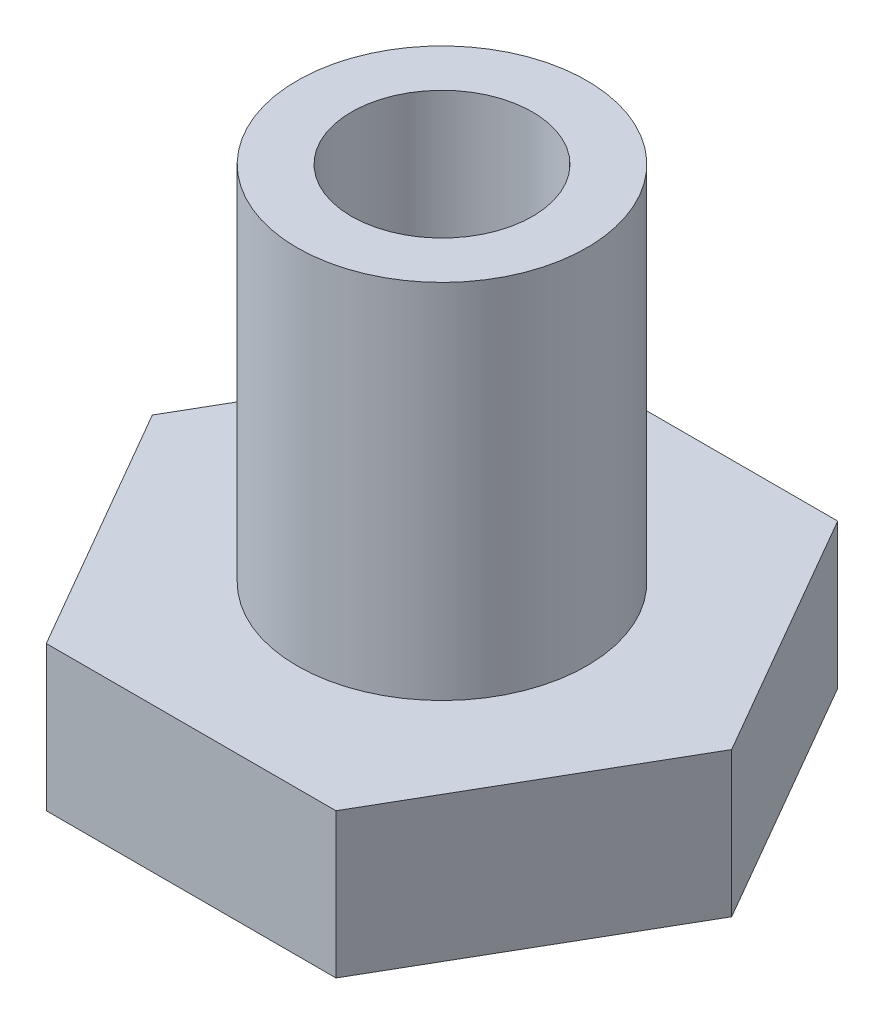
ISO-10303-21;
HEADER;
FILE_DESCRIPTION(('STEP AP214'),'2;1');
FILE_NAME('part.step','',(''),(''),'','','');
FILE_SCHEMA(('AUTOMOTIVE_DESIGN { 1 0 10303 214 1 1 1 1 }'));
ENDSEC;
DATA;
#1=APPLICATION_CONTEXT('core data for automotive mechanical design processes');
#2=APPLICATION_PROTOCOL_DEFINITION('international standard','automotive_design',2000,#1);
#3=PRODUCT_CONTEXT('',#1,'mechanical');
#4=PRODUCT('Part','Part','',(#3));
#5=PRODUCT_RELATED_PRODUCT_CATEGORY('part','',(#4));
#6=PRODUCT_DEFINITION_FORMATION('','',#4);
#7=PRODUCT_DEFINITION_CONTEXT('part definition',#1,'design');
#8=PRODUCT_DEFINITION('design','',#6,#7);
#9=PRODUCT_DEFINITION_SHAPE('','',#8);
#10=(LENGTH_UNIT() NAMED_UNIT(*) SI_UNIT(.MILLI.,.METRE.));
#11=(NAMED_UNIT(*) PLANE_ANGLE_UNIT() SI_UNIT($,.RADIAN.));
#12=(NAMED_UNIT(*) SI_UNIT($,.STERADIAN.) SOLID_ANGLE_UNIT());
#13=UNCERTAINTY_MEASURE_WITH_UNIT(LENGTH_MEASURE(1.E-05),#10,'distance_accuracy_value','');
#14=(GEOMETRIC_REPRESENTATION_CONTEXT(3) GLOBAL_UNCERTAINTY_ASSIGNED_CONTEXT((#13)) GLOBAL_UNIT_ASSIGNED_CONTEXT((#10,
#11,#12)) REPRESENTATION_CONTEXT('',''));
#15=CARTESIAN_POINT('',(0.,0.,0.));
#16=DIRECTION('',(0.,0.,1.));
#17=DIRECTION('',(1.,0.,0.));
#18=AXIS2_PLACEMENT_3D('',#15,#16,#17);
#19=CARTESIAN_POINT('',(-8.,8.,13.856406460551));
#20=DIRECTION('',(0.,0.,-1.));
#21=DIRECTION('',(-1.,0.,0.));
#22=AXIS2_PLACEMENT_3D('',#19,#20,#21);
#23=PLANE('',#22);
#24=DIRECTION('',(1.,0.,0.));
#25=VECTOR('',#24,1.);
#26=CARTESIAN_POINT('',(-8.,0.,13.856406460551));
#27=LINE('',#26,#25);
#28=CARTESIAN_POINT('',(-8.,0.,13.856406460551));
#29=VERTEX_POINT('',#28);
#30=CARTESIAN_POINT('',(8.,0.,13.856406460551));
#31=VERTEX_POINT('',#30);
#32=EDGE_CURVE('E119',#29,#31,#27,.T.);
#33=ORIENTED_EDGE('',*,*,#32,.T.);
#34=DIRECTION('',(0.,-1.,0.));
#35=VECTOR('',#34,1.);
#36=CARTESIAN_POINT('',(8.,8.,13.856406460551));
#37=LINE('',#36,#35);
#38=CARTESIAN_POINT('',(8.,8.,13.856406460551));
#39=VERTEX_POINT('',#38);
#40=EDGE_CURVE('E11',#39,#31,#37,.T.);
#41=ORIENTED_EDGE('',*,*,#40,.F.);
#42=DIRECTION('',(1.,0.,0.));
#43=VECTOR('',#42,1.);
#44=CARTESIAN_POINT('',(-8.,8.,13.856406460551));
#45=LINE('',#44,#43);
#46=CARTESIAN_POINT('',(-8.,8.,13.856406460551));
#47=VERTEX_POINT('',#46);
#48=EDGE_CURVE('E130',#47,#39,#45,.T.);
#49=ORIENTED_EDGE('',*,*,#48,.F.);
#50=DIRECTION('',(0.,-1.,0.));
#51=VECTOR('',#50,1.);
#52=CARTESIAN_POINT('',(-8.,8.,13.856406460551));
#53=LINE('',#52,#51);
#54=EDGE_CURVE('E115',#47,#29,#53,.T.);
#55=ORIENTED_EDGE('',*,*,#54,.T.);
#56=EDGE_LOOP('',(#33,#41,#49,#55));
#57=FACE_BOUND('',#56,.T.);
#58=ADVANCED_FACE('F35',(#57),#23,.F.);
#59=CARTESIAN_POINT('',(8.,8.,13.856406460551));
#60=DIRECTION('',(-0.866025403784439,0.,-0.5));
#61=DIRECTION('',(-0.5,0.,0.866025403784438));
#62=AXIS2_PLACEMENT_3D('',#59,#60,#61);
#63=PLANE('',#62);
#64=DIRECTION('',(0.5,0.,-0.866025403784438));
#65=VECTOR('',#64,1.);
#66=CARTESIAN_POINT('',(8.,0.,13.856406460551));
#67=LINE('',#66,#65);
#68=CARTESIAN_POINT('',(16.,0.,0.));
#69=VERTEX_POINT('',#68);
#70=EDGE_CURVE('E122',#31,#69,#67,.T.);
#71=ORIENTED_EDGE('',*,*,#70,.T.);
#72=DIRECTION('',(0.,-1.,0.));
#73=VECTOR('',#72,1.);
#74=CARTESIAN_POINT('',(16.,8.,0.));
#75=LINE('',#74,#73);
#76=CARTESIAN_POINT('',(16.,8.,0.));
#77=VERTEX_POINT('',#76);
#78=EDGE_CURVE('E43',#77,#69,#75,.T.);
#79=ORIENTED_EDGE('',*,*,#78,.F.);
#80=DIRECTION('',(0.5,0.,-0.866025403784438));
#81=VECTOR('',#80,1.);
#82=CARTESIAN_POINT('',(8.,8.,13.856406460551));
#83=LINE('',#82,#81);
#84=EDGE_CURVE('E88',#39,#77,#83,.T.);
#85=ORIENTED_EDGE('',*,*,#84,.F.);
#86=ORIENTED_EDGE('',*,*,#40,.T.);
#87=EDGE_LOOP('',(#71,#79,#85,#86));
#88=FACE_BOUND('',#87,.T.);
#89=ADVANCED_FACE('F155',(#88),#63,.F.);
#90=CARTESIAN_POINT('',(16.,8.,0.));
#91=DIRECTION('',(-0.866025403784439,0.,0.5));
#92=DIRECTION('',(0.5,0.,0.866025403784439));
#93=AXIS2_PLACEMENT_3D('',#90,#91,#92);
#94=PLANE('',#93);
#95=DIRECTION('',(-0.5,0.,-0.866025403784439));
#96=VECTOR('',#95,1.);
#97=CARTESIAN_POINT('',(16.,0.,0.));
#98=LINE('',#97,#96);
#99=CARTESIAN_POINT('',(8.00000000000001,0.,-13.856406460551));
#100=VERTEX_POINT('',#99);
#101=EDGE_CURVE('E125',#69,#100,#98,.T.);
#102=ORIENTED_EDGE('',*,*,#101,.T.);
#103=DIRECTION('',(0.,-1.,0.));
#104=VECTOR('',#103,1.);
#105=CARTESIAN_POINT('',(8.00000000000001,8.,-13.856406460551));
#106=LINE('',#105,#104);
#107=CARTESIAN_POINT('',(8.00000000000001,8.,-13.856406460551));
#108=VERTEX_POINT('',#107);
#109=EDGE_CURVE('E110',#108,#100,#106,.T.);
#110=ORIENTED_EDGE('',*,*,#109,.F.);
#111=DIRECTION('',(-0.5,0.,-0.866025403784439));
#112=VECTOR('',#111,1.);
#113=CARTESIAN_POINT('',(16.,8.,0.));
#114=LINE('',#113,#112);
#115=EDGE_CURVE('E101',#77,#108,#114,.T.);
#116=ORIENTED_EDGE('',*,*,#115,.F.);
#117=ORIENTED_EDGE('',*,*,#78,.T.);
#118=EDGE_LOOP('',(#102,#110,#116,#117));
#119=FACE_BOUND('',#118,.T.);
#120=ADVANCED_FACE('F136',(#119),#94,.F.);
#121=CARTESIAN_POINT('',(8.00000000000001,8.,-13.856406460551));
#122=DIRECTION('',(0.,0.,1.));
#123=DIRECTION('',(1.,0.,0.));
#124=AXIS2_PLACEMENT_3D('',#121,#122,#123);
#125=PLANE('',#124);
#126=DIRECTION('',(-1.,0.,0.));
#127=VECTOR('',#126,1.);
#128=CARTESIAN_POINT('',(8.00000000000001,0.,-13.856406460551));
#129=LINE('',#128,#127);
#130=CARTESIAN_POINT('',(-7.99999999999999,0.,-13.856406460551));
#131=VERTEX_POINT('',#130);
#132=EDGE_CURVE('E109',#100,#131,#129,.T.);
#133=ORIENTED_EDGE('',*,*,#132,.T.);
#134=DIRECTION('',(0.,-1.,0.));
#135=VECTOR('',#134,1.);
#136=CARTESIAN_POINT('',(-7.99999999999999,8.,-13.856406460551));
#137=LINE('',#136,#135);
#138=CARTESIAN_POINT('',(-7.99999999999999,8.,-13.856406460551));
#139=VERTEX_POINT('',#138);
#140=EDGE_CURVE('E106',#139,#131,#137,.T.);
#141=ORIENTED_EDGE('',*,*,#140,.F.);
#142=DIRECTION('',(-1.,0.,0.));
#143=VECTOR('',#142,1.);
#144=CARTESIAN_POINT('',(8.00000000000001,8.,-13.856406460551));
#145=LINE('',#144,#143);
#146=EDGE_CURVE('E95',#108,#139,#145,.T.);
#147=ORIENTED_EDGE('',*,*,#146,.F.);
#148=ORIENTED_EDGE('',*,*,#109,.T.);
#149=EDGE_LOOP('',(#133,#141,#147,#148));
#150=FACE_BOUND('',#149,.T.);
#151=ADVANCED_FACE('F107',(#150),#125,.F.);
#152=CARTESIAN_POINT('',(-7.99999999999999,8.,-13.856406460551));
#153=DIRECTION('',(0.866025403784439,0.,0.5));
#154=DIRECTION('',(0.5,0.,-0.866025403784439));
#155=AXIS2_PLACEMENT_3D('',#152,#153,#154);
#156=PLANE('',#155);
#157=DIRECTION('',(-0.5,0.,0.866025403784439));
#158=VECTOR('',#157,1.);
#159=CARTESIAN_POINT('',(-7.99999999999999,0.,-13.856406460551));
#160=LINE('',#159,#158);
#161=CARTESIAN_POINT('',(-16.,0.,0.));
#162=VERTEX_POINT('',#161);
#163=EDGE_CURVE('E74',#131,#162,#160,.T.);
#164=ORIENTED_EDGE('',*,*,#163,.T.);
#165=DIRECTION('',(0.,-1.,0.));
#166=VECTOR('',#165,1.);
#167=CARTESIAN_POINT('',(-16.,8.,0.));
#168=LINE('',#167,#166);
#169=CARTESIAN_POINT('',(-16.,8.,0.));
#170=VERTEX_POINT('',#169);
#171=EDGE_CURVE('E111',#170,#162,#168,.T.);
#172=ORIENTED_EDGE('',*,*,#171,.F.);
#173=DIRECTION('',(-0.5,0.,0.866025403784439));
#174=VECTOR('',#173,1.);
#175=CARTESIAN_POINT('',(-7.99999999999999,8.,-13.856406460551));
#176=LINE('',#175,#174);
#177=EDGE_CURVE('E99',#139,#170,#176,.T.);
#178=ORIENTED_EDGE('',*,*,#177,.F.);
#179=ORIENTED_EDGE('',*,*,#140,.T.);
#180=EDGE_LOOP('',(#164,#172,#178,#179));
#181=FACE_BOUND('',#180,.T.);
#182=ADVANCED_FACE('F113',(#181),#156,.F.);
#183=CARTESIAN_POINT('',(-16.,8.,0.));
#184=DIRECTION('',(0.866025403784439,0.,-0.5));
#185=DIRECTION('',(-0.5,0.,-0.866025403784439));
#186=AXIS2_PLACEMENT_3D('',#183,#184,#185);
#187=PLANE('',#186);
#188=DIRECTION('',(0.5,0.,0.866025403784439));
#189=VECTOR('',#188,1.);
#190=CARTESIAN_POINT('',(-16.,0.,0.));
#191=LINE('',#190,#189);
#192=EDGE_CURVE('E80',#162,#29,#191,.T.);
#193=ORIENTED_EDGE('',*,*,#192,.T.);
#194=ORIENTED_EDGE('',*,*,#54,.F.);
#195=DIRECTION('',(0.5,0.,0.866025403784439));
#196=VECTOR('',#195,1.);
#197=CARTESIAN_POINT('',(-16.,8.,0.));
#198=LINE('',#197,#196);
#199=EDGE_CURVE('E51',#170,#47,#198,.T.);
#200=ORIENTED_EDGE('',*,*,#199,.F.);
#201=ORIENTED_EDGE('',*,*,#171,.T.);
#202=EDGE_LOOP('',(#193,#194,#200,#201));
#203=FACE_BOUND('',#202,.T.);
#204=ADVANCED_FACE('F143',(#203),#187,.F.);
#205=CARTESIAN_POINT('',(0.,8.,0.));
#206=DIRECTION('',(0.,1.,0.));
#207=DIRECTION('',(0.,0.,1.));
#208=AXIS2_PLACEMENT_3D('',#205,#206,#207);
#209=PLANE('',#208);
#210=CARTESIAN_POINT('',(0.,8.,0.));
#211=DIRECTION('',(0.,1.,0.));
#212=DIRECTION('',(0.,0.,1.));
#213=AXIS2_PLACEMENT_3D('',#210,#211,#212);
#214=CIRCLE('',#213,8.);
#215=CARTESIAN_POINT('',(0.,8.,8.));
#216=VERTEX_POINT('',#215);
#217=EDGE_CURVE('E237',#216,#216,#214,.T.);
#218=ORIENTED_EDGE('',*,*,#217,.F.);
#219=EDGE_LOOP('',(#218));
#220=FACE_BOUND('',#219,.T.);
#221=ORIENTED_EDGE('',*,*,#48,.T.);
#222=ORIENTED_EDGE('',*,*,#84,.T.);
#223=ORIENTED_EDGE('',*,*,#115,.T.);
#224=ORIENTED_EDGE('',*,*,#146,.T.);
#225=ORIENTED_EDGE('',*,*,#177,.T.);
#226=ORIENTED_EDGE('',*,*,#199,.T.);
#227=EDGE_LOOP('',(#221,#222,#223,#224,#225,#226));
#228=FACE_BOUND('',#227,.T.);
#229=ADVANCED_FACE('F97',(#220,#228),#209,.T.);
#230=CARTESIAN_POINT('',(0.,0.,0.));
#231=DIRECTION('',(0.,1.,0.));
#232=DIRECTION('',(0.,0.,1.));
#233=AXIS2_PLACEMENT_3D('',#230,#231,#232);
#234=PLANE('',#233);
#235=ORIENTED_EDGE('',*,*,#32,.F.);
#236=ORIENTED_EDGE('',*,*,#192,.F.);
#237=ORIENTED_EDGE('',*,*,#163,.F.);
#238=ORIENTED_EDGE('',*,*,#132,.F.);
#239=ORIENTED_EDGE('',*,*,#101,.F.);
#240=ORIENTED_EDGE('',*,*,#70,.F.);
#241=EDGE_LOOP('',(#235,#236,#237,#238,#239,#240));
#242=FACE_BOUND('',#241,.T.);
#243=ADVANCED_FACE('F139',(#242),#234,.F.);
#244=CARTESIAN_POINT('',(0.,28.,0.));
#245=DIRECTION('',(0.,-1.,0.));
#246=DIRECTION('',(0.,0.,-1.));
#247=AXIS2_PLACEMENT_3D('',#244,#245,#246);
#248=CYLINDRICAL_SURFACE('',#247,8.);
#249=CARTESIAN_POINT('',(0.,28.,0.));
#250=DIRECTION('',(0.,1.,0.));
#251=DIRECTION('',(0.,0.,1.));
#252=AXIS2_PLACEMENT_3D('',#249,#250,#251);
#253=CIRCLE('',#252,8.);
#254=CARTESIAN_POINT('',(0.,28.,8.));
#255=VERTEX_POINT('',#254);
#256=EDGE_CURVE('E123',#255,#255,#253,.T.);
#257=ORIENTED_EDGE('',*,*,#256,.F.);
#258=EDGE_LOOP('',(#257));
#259=FACE_BOUND('',#258,.T.);
#260=ORIENTED_EDGE('',*,*,#217,.T.);
#261=EDGE_LOOP('',(#260));
#262=FACE_BOUND('',#261,.T.);
#263=ADVANCED_FACE('F187',(#259,#262),#248,.T.);
#264=CARTESIAN_POINT('',(0.,28.,0.));
#265=DIRECTION('',(0.,1.,0.));
#266=DIRECTION('',(0.,0.,1.));
#267=AXIS2_PLACEMENT_3D('',#264,#265,#266);
#268=PLANE('',#267);
#269=CARTESIAN_POINT('',(0.,28.,0.));
#270=DIRECTION('',(0.,1.,0.));
#271=DIRECTION('',(0.,0.,1.));
#272=AXIS2_PLACEMENT_3D('',#269,#270,#271);
#273=CIRCLE('',#272,5.);
#274=CARTESIAN_POINT('',(0.,28.,5.));
#275=VERTEX_POINT('',#274);
#276=EDGE_CURVE('E238',#275,#275,#273,.T.);
#277=ORIENTED_EDGE('',*,*,#276,.F.);
#278=EDGE_LOOP('',(#277));
#279=FACE_BOUND('',#278,.T.);
#280=ORIENTED_EDGE('',*,*,#256,.T.);
#281=EDGE_LOOP('',(#280));
#282=FACE_BOUND('',#281,.T.);
#283=ADVANCED_FACE('F200',(#279,#282),#268,.T.);
#284=CARTESIAN_POINT('',(0.,8.,0.));
#285=DIRECTION('',(0.,1.,0.));
#286=DIRECTION('',(0.,0.,1.));
#287=AXIS2_PLACEMENT_3D('',#284,#285,#286);
#288=CYLINDRICAL_SURFACE('',#287,5.);
#289=CARTESIAN_POINT('',(0.,8.,0.));
#290=DIRECTION('',(0.,1.,0.));
#291=DIRECTION('',(0.,0.,1.));
#292=AXIS2_PLACEMENT_3D('',#289,#290,#291);
#293=CIRCLE('',#292,5.);
#294=CARTESIAN_POINT('',(0.,8.,5.));
#295=VERTEX_POINT('',#294);
#296=EDGE_CURVE('E236',#295,#295,#293,.T.);
#297=ORIENTED_EDGE('',*,*,#296,.F.);
#298=EDGE_LOOP('',(#297));
#299=FACE_BOUND('',#298,.T.);
#300=ORIENTED_EDGE('',*,*,#276,.T.);
#301=EDGE_LOOP('',(#300));
#302=FACE_BOUND('',#301,.T.);
#303=ADVANCED_FACE('F210',(#299,#302),#288,.F.);
#304=CARTESIAN_POINT('',(0.,8.,0.));
#305=DIRECTION('',(0.,1.,0.));
#306=DIRECTION('',(0.,0.,1.));
#307=AXIS2_PLACEMENT_3D('',#304,#305,#306);
#308=PLANE('',#307);
#309=ORIENTED_EDGE('',*,*,#296,.T.);
#310=EDGE_LOOP('',(#309));
#311=FACE_BOUND('',#310,.T.);
#312=ADVANCED_FACE('F220',(#311),#308,.T.);
#313=CLOSED_SHELL('',(#58,#89,#120,#151,#182,#204,#229,#243,#263,#283,#303,#312));
#314=MANIFOLD_SOLID_BREP('B2',#313);
#315=ADVANCED_BREP_SHAPE_REPRESENTATION('',(#18,#314),#14);
#316=SHAPE_DEFINITION_REPRESENTATION(#9,#315);
ENDSEC;
END-ISO-10303-21;
